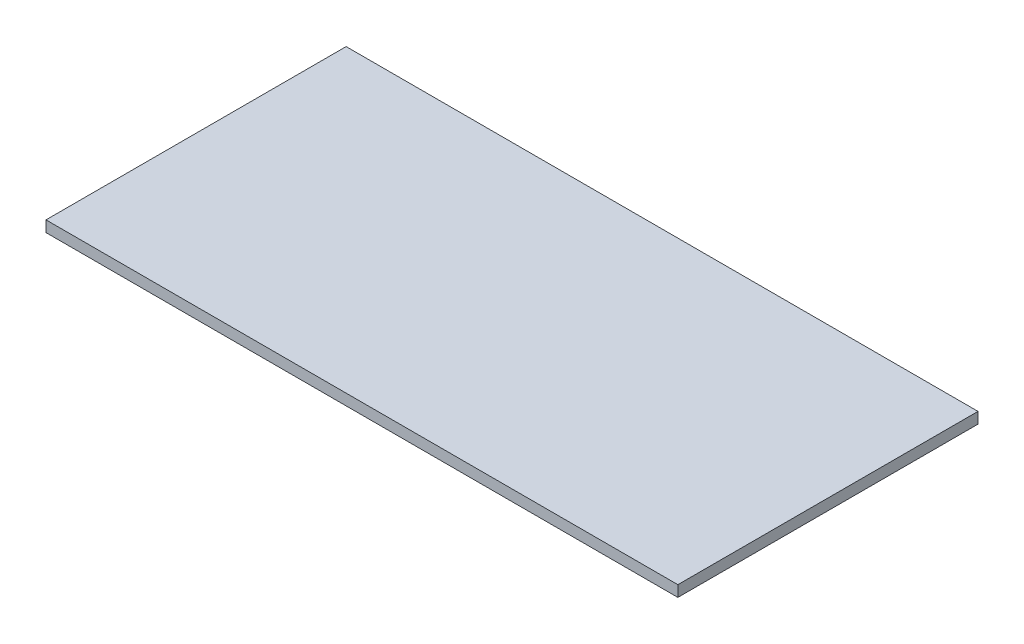
ISO-10303-21;
HEADER;
FILE_DESCRIPTION(('STEP AP214'),'2;1');
FILE_NAME('part.step','',(''),(''),'','','');
FILE_SCHEMA(('AUTOMOTIVE_DESIGN { 1 0 10303 214 1 1 1 1 }'));
ENDSEC;
DATA;
#1=APPLICATION_CONTEXT('core data for automotive mechanical design processes');
#2=APPLICATION_PROTOCOL_DEFINITION('international standard','automotive_design',2000,#1);
#3=PRODUCT_CONTEXT('',#1,'mechanical');
#4=PRODUCT('Part','Part','',(#3));
#5=PRODUCT_RELATED_PRODUCT_CATEGORY('part','',(#4));
#6=PRODUCT_DEFINITION_FORMATION('','',#4);
#7=PRODUCT_DEFINITION_CONTEXT('part definition',#1,'design');
#8=PRODUCT_DEFINITION('design','',#6,#7);
#9=PRODUCT_DEFINITION_SHAPE('','',#8);
#10=(LENGTH_UNIT() NAMED_UNIT(*) SI_UNIT(.MILLI.,.METRE.));
#11=(NAMED_UNIT(*) PLANE_ANGLE_UNIT() SI_UNIT($,.RADIAN.));
#12=(NAMED_UNIT(*) SI_UNIT($,.STERADIAN.) SOLID_ANGLE_UNIT());
#13=UNCERTAINTY_MEASURE_WITH_UNIT(LENGTH_MEASURE(1.E-05),#10,'distance_accuracy_value','');
#14=(GEOMETRIC_REPRESENTATION_CONTEXT(3) GLOBAL_UNCERTAINTY_ASSIGNED_CONTEXT((#13)) GLOBAL_UNIT_ASSIGNED_CONTEXT((#10,
#11,#12)) REPRESENTATION_CONTEXT('',''));
#15=CARTESIAN_POINT('',(0.,0.,0.));
#16=DIRECTION('',(0.,0.,1.));
#17=DIRECTION('',(1.,0.,0.));
#18=AXIS2_PLACEMENT_3D('',#15,#16,#17);
#19=CARTESIAN_POINT('',(0.,1.4,0.));
#20=DIRECTION('',(1.,0.,0.));
#21=DIRECTION('',(0.,0.,-1.));
#22=AXIS2_PLACEMENT_3D('',#19,#20,#21);
#23=PLANE('',#22);
#24=DIRECTION('',(0.,0.,1.));
#25=VECTOR('',#24,1.);
#26=CARTESIAN_POINT('',(0.,0.,0.));
#27=LINE('',#26,#25);
#28=CARTESIAN_POINT('',(0.,0.,-38.));
#29=VERTEX_POINT('',#28);
#30=CARTESIAN_POINT('',(0.,0.,0.));
#31=VERTEX_POINT('',#30);
#32=EDGE_CURVE('E113',#29,#31,#27,.T.);
#33=ORIENTED_EDGE('',*,*,#32,.T.);
#34=DIRECTION('',(0.,-1.,0.));
#35=VECTOR('',#34,1.);
#36=CARTESIAN_POINT('',(0.,1.4,0.));
#37=LINE('',#36,#35);
#38=CARTESIAN_POINT('',(0.,1.4,0.));
#39=VERTEX_POINT('',#38);
#40=EDGE_CURVE('E11',#39,#31,#37,.T.);
#41=ORIENTED_EDGE('',*,*,#40,.F.);
#42=DIRECTION('',(0.,0.,1.));
#43=VECTOR('',#42,1.);
#44=CARTESIAN_POINT('',(0.,1.4,0.));
#45=LINE('',#44,#43);
#46=CARTESIAN_POINT('',(0.,1.4,-38.));
#47=VERTEX_POINT('',#46);
#48=EDGE_CURVE('E97',#47,#39,#45,.T.);
#49=ORIENTED_EDGE('',*,*,#48,.F.);
#50=DIRECTION('',(0.,-1.,0.));
#51=VECTOR('',#50,1.);
#52=CARTESIAN_POINT('',(0.,1.4,-38.));
#53=LINE('',#52,#51);
#54=EDGE_CURVE('E109',#47,#29,#53,.T.);
#55=ORIENTED_EDGE('',*,*,#54,.T.);
#56=EDGE_LOOP('',(#33,#41,#49,#55));
#57=FACE_BOUND('',#56,.T.);
#58=ADVANCED_FACE('F45',(#57),#23,.F.);
#59=CARTESIAN_POINT('',(0.,1.4,0.));
#60=DIRECTION('',(0.,0.,-1.));
#61=DIRECTION('',(-1.,0.,0.));
#62=AXIS2_PLACEMENT_3D('',#59,#60,#61);
#63=PLANE('',#62);
#64=DIRECTION('',(1.,0.,0.));
#65=VECTOR('',#64,1.);
#66=CARTESIAN_POINT('',(0.,0.,0.));
#67=LINE('',#66,#65);
#68=CARTESIAN_POINT('',(80.,0.,0.));
#69=VERTEX_POINT('',#68);
#70=EDGE_CURVE('E102',#31,#69,#67,.T.);
#71=ORIENTED_EDGE('',*,*,#70,.T.);
#72=DIRECTION('',(0.,-1.,0.));
#73=VECTOR('',#72,1.);
#74=CARTESIAN_POINT('',(80.,1.4,0.));
#75=LINE('',#74,#73);
#76=CARTESIAN_POINT('',(80.,1.4,0.));
#77=VERTEX_POINT('',#76);
#78=EDGE_CURVE('E54',#77,#69,#75,.T.);
#79=ORIENTED_EDGE('',*,*,#78,.F.);
#80=DIRECTION('',(1.,0.,0.));
#81=VECTOR('',#80,1.);
#82=CARTESIAN_POINT('',(0.,1.4,0.));
#83=LINE('',#82,#81);
#84=EDGE_CURVE('E92',#39,#77,#83,.T.);
#85=ORIENTED_EDGE('',*,*,#84,.F.);
#86=ORIENTED_EDGE('',*,*,#40,.T.);
#87=EDGE_LOOP('',(#71,#79,#85,#86));
#88=FACE_BOUND('',#87,.T.);
#89=ADVANCED_FACE('F101',(#88),#63,.F.);
#90=CARTESIAN_POINT('',(80.,1.4,0.));
#91=DIRECTION('',(-1.,0.,0.));
#92=DIRECTION('',(0.,0.,1.));
#93=AXIS2_PLACEMENT_3D('',#90,#91,#92);
#94=PLANE('',#93);
#95=DIRECTION('',(0.,0.,-1.));
#96=VECTOR('',#95,1.);
#97=CARTESIAN_POINT('',(80.,0.,0.));
#98=LINE('',#97,#96);
#99=CARTESIAN_POINT('',(80.,0.,-38.));
#100=VERTEX_POINT('',#99);
#101=EDGE_CURVE('E79',#69,#100,#98,.T.);
#102=ORIENTED_EDGE('',*,*,#101,.T.);
#103=DIRECTION('',(0.,-1.,0.));
#104=VECTOR('',#103,1.);
#105=CARTESIAN_POINT('',(80.,1.4,-38.));
#106=LINE('',#105,#104);
#107=CARTESIAN_POINT('',(80.,1.4,-38.));
#108=VERTEX_POINT('',#107);
#109=EDGE_CURVE('E104',#108,#100,#106,.T.);
#110=ORIENTED_EDGE('',*,*,#109,.F.);
#111=DIRECTION('',(0.,0.,-1.));
#112=VECTOR('',#111,1.);
#113=CARTESIAN_POINT('',(80.,1.4,0.));
#114=LINE('',#113,#112);
#115=EDGE_CURVE('E95',#77,#108,#114,.T.);
#116=ORIENTED_EDGE('',*,*,#115,.F.);
#117=ORIENTED_EDGE('',*,*,#78,.T.);
#118=EDGE_LOOP('',(#102,#110,#116,#117));
#119=FACE_BOUND('',#118,.T.);
#120=ADVANCED_FACE('F105',(#119),#94,.F.);
#121=CARTESIAN_POINT('',(0.,1.4,-38.));
#122=DIRECTION('',(0.,0.,1.));
#123=DIRECTION('',(1.,0.,0.));
#124=AXIS2_PLACEMENT_3D('',#121,#122,#123);
#125=PLANE('',#124);
#126=DIRECTION('',(-1.,0.,0.));
#127=VECTOR('',#126,1.);
#128=CARTESIAN_POINT('',(0.,0.,-38.));
#129=LINE('',#128,#127);
#130=EDGE_CURVE('E85',#100,#29,#129,.T.);
#131=ORIENTED_EDGE('',*,*,#130,.T.);
#132=ORIENTED_EDGE('',*,*,#54,.F.);
#133=DIRECTION('',(-1.,0.,0.));
#134=VECTOR('',#133,1.);
#135=CARTESIAN_POINT('',(0.,1.4,-38.));
#136=LINE('',#135,#134);
#137=EDGE_CURVE('E62',#108,#47,#136,.T.);
#138=ORIENTED_EDGE('',*,*,#137,.F.);
#139=ORIENTED_EDGE('',*,*,#109,.T.);
#140=EDGE_LOOP('',(#131,#132,#138,#139));
#141=FACE_BOUND('',#140,.T.);
#142=ADVANCED_FACE('F126',(#141),#125,.F.);
#143=CARTESIAN_POINT('',(0.,1.4,0.));
#144=DIRECTION('',(0.,-1.,0.));
#145=DIRECTION('',(0.,0.,-1.));
#146=AXIS2_PLACEMENT_3D('',#143,#144,#145);
#147=PLANE('',#146);
#148=ORIENTED_EDGE('',*,*,#48,.T.);
#149=ORIENTED_EDGE('',*,*,#84,.T.);
#150=ORIENTED_EDGE('',*,*,#115,.T.);
#151=ORIENTED_EDGE('',*,*,#137,.T.);
#152=EDGE_LOOP('',(#148,#149,#150,#151));
#153=FACE_BOUND('',#152,.T.);
#154=ADVANCED_FACE('F93',(#153),#147,.F.);
#155=CARTESIAN_POINT('',(0.,0.,0.));
#156=DIRECTION('',(0.,-1.,0.));
#157=DIRECTION('',(0.,0.,-1.));
#158=AXIS2_PLACEMENT_3D('',#155,#156,#157);
#159=PLANE('',#158);
#160=ORIENTED_EDGE('',*,*,#32,.F.);
#161=ORIENTED_EDGE('',*,*,#130,.F.);
#162=ORIENTED_EDGE('',*,*,#101,.F.);
#163=ORIENTED_EDGE('',*,*,#70,.F.);
#164=EDGE_LOOP('',(#160,#161,#162,#163));
#165=FACE_BOUND('',#164,.T.);
#166=ADVANCED_FACE('F129',(#165),#159,.T.);
#167=CLOSED_SHELL('',(#58,#89,#120,#142,#154,#166));
#168=MANIFOLD_SOLID_BREP('B2',#167);
#169=ADVANCED_BREP_SHAPE_REPRESENTATION('',(#18,#168),#14);
#170=SHAPE_DEFINITION_REPRESENTATION(#9,#169);
ENDSEC;
END-ISO-10303-21;
